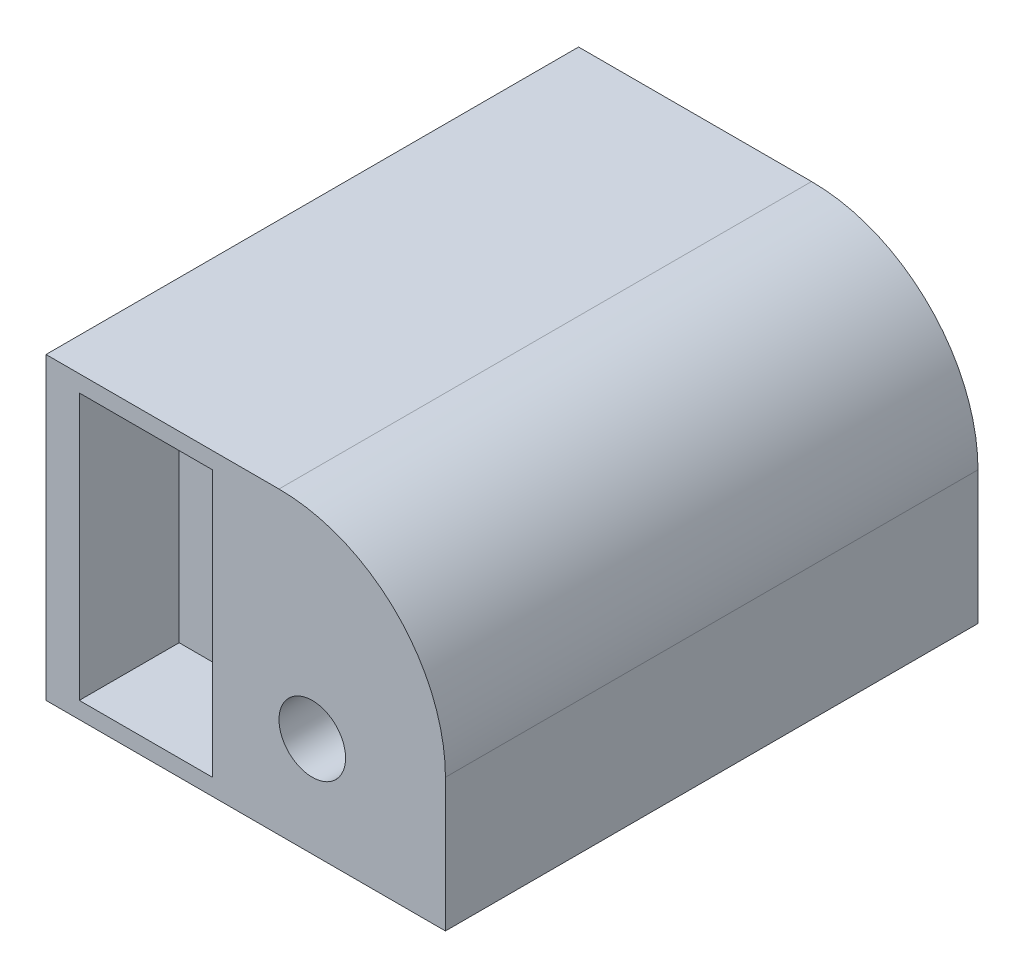
ISO-10303-21;
HEADER;
FILE_DESCRIPTION(('STEP AP214'),'2;1');
FILE_NAME('part.step','',(''),(''),'','','');
FILE_SCHEMA(('AUTOMOTIVE_DESIGN { 1 0 10303 214 1 1 1 1 }'));
ENDSEC;
DATA;
#1=APPLICATION_CONTEXT('core data for automotive mechanical design processes');
#2=APPLICATION_PROTOCOL_DEFINITION('international standard','automotive_design',2000,#1);
#3=PRODUCT_CONTEXT('',#1,'mechanical');
#4=PRODUCT('Part','Part','',(#3));
#5=PRODUCT_RELATED_PRODUCT_CATEGORY('part','',(#4));
#6=PRODUCT_DEFINITION_FORMATION('','',#4);
#7=PRODUCT_DEFINITION_CONTEXT('part definition',#1,'design');
#8=PRODUCT_DEFINITION('design','',#6,#7);
#9=PRODUCT_DEFINITION_SHAPE('','',#8);
#10=(LENGTH_UNIT() NAMED_UNIT(*) SI_UNIT(.MILLI.,.METRE.));
#11=(NAMED_UNIT(*) PLANE_ANGLE_UNIT() SI_UNIT($,.RADIAN.));
#12=(NAMED_UNIT(*) SI_UNIT($,.STERADIAN.) SOLID_ANGLE_UNIT());
#13=UNCERTAINTY_MEASURE_WITH_UNIT(LENGTH_MEASURE(1.E-05),#10,'distance_accuracy_value','');
#14=(GEOMETRIC_REPRESENTATION_CONTEXT(3) GLOBAL_UNCERTAINTY_ASSIGNED_CONTEXT((#13)) GLOBAL_UNIT_ASSIGNED_CONTEXT((#10,
#11,#12)) REPRESENTATION_CONTEXT('',''));
#15=CARTESIAN_POINT('',(0.,0.,0.));
#16=DIRECTION('',(0.,0.,1.));
#17=DIRECTION('',(1.,0.,0.));
#18=AXIS2_PLACEMENT_3D('',#15,#16,#17);
#19=CARTESIAN_POINT('',(1.41903870162297,6.69881398252185,101.6));
#20=DIRECTION('',(0.,0.,1.));
#21=DIRECTION('',(1.,0.,0.));
#22=AXIS2_PLACEMENT_3D('',#19,#20,#21);
#23=CYLINDRICAL_SURFACE('',#22,31.75);
#24=DIRECTION('',(0.,0.,1.));
#25=VECTOR('',#24,1.);
#26=CARTESIAN_POINT('',(33.169038701623,6.69881398252185,101.6));
#27=LINE('',#26,#25);
#28=CARTESIAN_POINT('',(33.169038701623,6.69881398252186,0.));
#29=VERTEX_POINT('',#28);
#30=CARTESIAN_POINT('',(33.169038701623,6.69881398252186,101.6));
#31=VERTEX_POINT('',#30);
#32=EDGE_CURVE('E282',#29,#31,#27,.T.);
#33=ORIENTED_EDGE('',*,*,#32,.F.);
#34=CARTESIAN_POINT('',(1.41903870162297,6.69881398252185,0.));
#35=DIRECTION('',(0.,0.,1.));
#36=DIRECTION('',(1.,0.,0.));
#37=AXIS2_PLACEMENT_3D('',#34,#35,#36);
#38=CIRCLE('',#37,31.75);
#39=CARTESIAN_POINT('',(1.41903870162297,38.4488139825219,0.));
#40=VERTEX_POINT('',#39);
#41=EDGE_CURVE('E49',#40,#29,#38,.F.);
#42=ORIENTED_EDGE('',*,*,#41,.F.);
#43=DIRECTION('',(0.,0.,1.));
#44=VECTOR('',#43,1.);
#45=CARTESIAN_POINT('',(1.41903870162297,38.4488139825219,101.6));
#46=LINE('',#45,#44);
#47=CARTESIAN_POINT('',(1.41903870162297,38.4488139825219,101.6));
#48=VERTEX_POINT('',#47);
#49=EDGE_CURVE('E286',#48,#40,#46,.F.);
#50=ORIENTED_EDGE('',*,*,#49,.F.);
#51=CARTESIAN_POINT('',(1.41903870162297,6.69881398252185,101.6));
#52=DIRECTION('',(0.,0.,1.));
#53=DIRECTION('',(1.,0.,0.));
#54=AXIS2_PLACEMENT_3D('',#51,#52,#53);
#55=CIRCLE('',#54,31.75);
#56=EDGE_CURVE('E11',#31,#48,#55,.T.);
#57=ORIENTED_EDGE('',*,*,#56,.F.);
#58=EDGE_LOOP('',(#33,#42,#50,#57));
#59=FACE_BOUND('',#58,.T.);
#60=ADVANCED_FACE('F41',(#59),#23,.T.);
#61=CARTESIAN_POINT('',(0.,0.,101.6));
#62=DIRECTION('',(0.,0.,1.));
#63=DIRECTION('',(1.,0.,0.));
#64=AXIS2_PLACEMENT_3D('',#61,#62,#63);
#65=PLANE('',#64);
#66=DIRECTION('',(0.,-1.,0.));
#67=VECTOR('',#66,1.);
#68=CARTESIAN_POINT('',(-36.680961298377,35.2738139825219,101.6));
#69=LINE('',#68,#67);
#70=CARTESIAN_POINT('',(-36.680961298377,35.2738139825219,101.6));
#71=VERTEX_POINT('',#70);
#72=CARTESIAN_POINT('',(-36.680961298377,-15.5261860174781,101.6));
#73=VERTEX_POINT('',#72);
#74=EDGE_CURVE('E140',#71,#73,#69,.T.);
#75=ORIENTED_EDGE('',*,*,#74,.F.);
#76=DIRECTION('',(-1.,0.,0.));
#77=VECTOR('',#76,1.);
#78=CARTESIAN_POINT('',(-36.680961298377,35.2738139825219,101.6));
#79=LINE('',#78,#77);
#80=CARTESIAN_POINT('',(-11.280961298377,35.2738139825219,101.6));
#81=VERTEX_POINT('',#80);
#82=EDGE_CURVE('E160',#81,#71,#79,.T.);
#83=ORIENTED_EDGE('',*,*,#82,.F.);
#84=DIRECTION('',(0.,1.,0.));
#85=VECTOR('',#84,1.);
#86=CARTESIAN_POINT('',(-11.280961298377,35.2738139825219,101.6));
#87=LINE('',#86,#85);
#88=CARTESIAN_POINT('',(-11.280961298377,-15.5261860174781,101.6));
#89=VERTEX_POINT('',#88);
#90=EDGE_CURVE('E164',#89,#81,#87,.T.);
#91=ORIENTED_EDGE('',*,*,#90,.F.);
#92=DIRECTION('',(1.,0.,0.));
#93=VECTOR('',#92,1.);
#94=CARTESIAN_POINT('',(-36.680961298377,-15.5261860174781,101.6));
#95=LINE('',#94,#93);
#96=EDGE_CURVE('E176',#73,#89,#95,.T.);
#97=ORIENTED_EDGE('',*,*,#96,.F.);
#98=EDGE_LOOP('',(#75,#83,#91,#97));
#99=FACE_BOUND('',#98,.T.);
#100=DIRECTION('',(0.,1.,0.));
#101=VECTOR('',#100,1.);
#102=CARTESIAN_POINT('',(33.169038701623,38.4488139825219,101.6));
#103=LINE('',#102,#101);
#104=CARTESIAN_POINT('',(33.169038701623,-18.7011860174781,101.6));
#105=VERTEX_POINT('',#104);
#106=EDGE_CURVE('E252',#105,#31,#103,.T.);
#107=ORIENTED_EDGE('',*,*,#106,.T.);
#108=ORIENTED_EDGE('',*,*,#56,.T.);
#109=DIRECTION('',(-1.,0.,0.));
#110=VECTOR('',#109,1.);
#111=CARTESIAN_POINT('',(-43.030961298377,38.4488139825219,101.6));
#112=LINE('',#111,#110);
#113=CARTESIAN_POINT('',(-43.030961298377,38.4488139825219,101.6));
#114=VERTEX_POINT('',#113);
#115=EDGE_CURVE('E255',#48,#114,#112,.T.);
#116=ORIENTED_EDGE('',*,*,#115,.T.);
#117=DIRECTION('',(0.,-1.,0.));
#118=VECTOR('',#117,1.);
#119=CARTESIAN_POINT('',(-43.030961298377,38.4488139825219,101.6));
#120=LINE('',#119,#118);
#121=CARTESIAN_POINT('',(-43.030961298377,-18.7011860174781,101.6));
#122=VERTEX_POINT('',#121);
#123=EDGE_CURVE('E244',#114,#122,#120,.T.);
#124=ORIENTED_EDGE('',*,*,#123,.T.);
#125=DIRECTION('',(1.,0.,0.));
#126=VECTOR('',#125,1.);
#127=CARTESIAN_POINT('',(-43.030961298377,-18.7011860174781,101.6));
#128=LINE('',#127,#126);
#129=EDGE_CURVE('E248',#122,#105,#128,.T.);
#130=ORIENTED_EDGE('',*,*,#129,.T.);
#131=EDGE_LOOP('',(#107,#108,#116,#124,#130));
#132=FACE_BOUND('',#131,.T.);
#133=CARTESIAN_POINT('',(7.76903870162297,0.348813982521855,101.6));
#134=DIRECTION('',(0.,0.,1.));
#135=DIRECTION('',(1.,0.,0.));
#136=AXIS2_PLACEMENT_3D('',#133,#134,#135);
#137=CIRCLE('',#136,6.35);
#138=CARTESIAN_POINT('',(14.119038701623,0.348813982521855,101.6));
#139=VERTEX_POINT('',#138);
#140=EDGE_CURVE('E236',#139,#139,#137,.T.);
#141=ORIENTED_EDGE('',*,*,#140,.F.);
#142=EDGE_LOOP('',(#141));
#143=FACE_BOUND('',#142,.T.);
#144=ADVANCED_FACE('F309',(#99,#132,#143),#65,.T.);
#145=CARTESIAN_POINT('',(0.,0.,0.));
#146=DIRECTION('',(0.,0.,1.));
#147=DIRECTION('',(1.,0.,0.));
#148=AXIS2_PLACEMENT_3D('',#145,#146,#147);
#149=PLANE('',#148);
#150=DIRECTION('',(-1.,0.,0.));
#151=VECTOR('',#150,1.);
#152=CARTESIAN_POINT('',(-43.030961298377,38.4488139825219,0.));
#153=LINE('',#152,#151);
#154=CARTESIAN_POINT('',(-43.030961298377,38.4488139825219,0.));
#155=VERTEX_POINT('',#154);
#156=EDGE_CURVE('E249',#40,#155,#153,.T.);
#157=ORIENTED_EDGE('',*,*,#156,.F.);
#158=ORIENTED_EDGE('',*,*,#41,.T.);
#159=DIRECTION('',(0.,1.,0.));
#160=VECTOR('',#159,1.);
#161=CARTESIAN_POINT('',(33.169038701623,38.4488139825219,0.));
#162=LINE('',#161,#160);
#163=CARTESIAN_POINT('',(33.169038701623,-18.7011860174781,0.));
#164=VERTEX_POINT('',#163);
#165=EDGE_CURVE('E265',#164,#29,#162,.T.);
#166=ORIENTED_EDGE('',*,*,#165,.F.);
#167=DIRECTION('',(1.,0.,0.));
#168=VECTOR('',#167,1.);
#169=CARTESIAN_POINT('',(-43.030961298377,-18.7011860174781,0.));
#170=LINE('',#169,#168);
#171=CARTESIAN_POINT('',(-43.030961298377,-18.7011860174781,0.));
#172=VERTEX_POINT('',#171);
#173=EDGE_CURVE('E262',#172,#164,#170,.T.);
#174=ORIENTED_EDGE('',*,*,#173,.F.);
#175=DIRECTION('',(0.,-1.,0.));
#176=VECTOR('',#175,1.);
#177=CARTESIAN_POINT('',(-43.030961298377,38.4488139825219,0.));
#178=LINE('',#177,#176);
#179=EDGE_CURVE('E240',#155,#172,#178,.T.);
#180=ORIENTED_EDGE('',*,*,#179,.F.);
#181=EDGE_LOOP('',(#157,#158,#166,#174,#180));
#182=FACE_BOUND('',#181,.T.);
#183=CARTESIAN_POINT('',(7.76903870162297,0.348813982521855,0.));
#184=DIRECTION('',(0.,0.,1.));
#185=DIRECTION('',(1.,0.,0.));
#186=AXIS2_PLACEMENT_3D('',#183,#184,#185);
#187=CIRCLE('',#186,6.35);
#188=CARTESIAN_POINT('',(14.119038701623,0.348813982521855,0.));
#189=VERTEX_POINT('',#188);
#190=EDGE_CURVE('E226',#189,#189,#187,.T.);
#191=ORIENTED_EDGE('',*,*,#190,.T.);
#192=EDGE_LOOP('',(#191));
#193=FACE_BOUND('',#192,.T.);
#194=ADVANCED_FACE('F292',(#182,#193),#149,.F.);
#195=CARTESIAN_POINT('',(-43.030961298377,38.4488139825219,101.6));
#196=DIRECTION('',(1.,0.,0.));
#197=DIRECTION('',(0.,0.,-1.));
#198=AXIS2_PLACEMENT_3D('',#195,#196,#197);
#199=PLANE('',#198);
#200=DIRECTION('',(0.,0.,1.));
#201=VECTOR('',#200,1.);
#202=CARTESIAN_POINT('',(-43.030961298377,-2.82618601747813,6.35));
#203=LINE('',#202,#201);
#204=CARTESIAN_POINT('',(-43.030961298377,-2.82618601747813,6.35000000000001));
#205=VERTEX_POINT('',#204);
#206=CARTESIAN_POINT('',(-43.030961298377,-2.82618601747813,57.15));
#207=VERTEX_POINT('',#206);
#208=EDGE_CURVE('E212',#205,#207,#203,.T.);
#209=ORIENTED_EDGE('',*,*,#208,.F.);
#210=DIRECTION('',(0.,-1.,0.));
#211=VECTOR('',#210,1.);
#212=CARTESIAN_POINT('',(-43.030961298377,22.5738139825219,6.35));
#213=LINE('',#212,#211);
#214=CARTESIAN_POINT('',(-43.030961298377,22.5738139825219,6.35));
#215=VERTEX_POINT('',#214);
#216=EDGE_CURVE('E186',#215,#205,#213,.T.);
#217=ORIENTED_EDGE('',*,*,#216,.F.);
#218=DIRECTION('',(0.,0.,-1.));
#219=VECTOR('',#218,1.);
#220=CARTESIAN_POINT('',(-43.030961298377,22.5738139825219,6.35));
#221=LINE('',#220,#219);
#222=CARTESIAN_POINT('',(-43.030961298377,22.5738139825219,57.15));
#223=VERTEX_POINT('',#222);
#224=EDGE_CURVE('E197',#223,#215,#221,.T.);
#225=ORIENTED_EDGE('',*,*,#224,.F.);
#226=DIRECTION('',(0.,1.,0.));
#227=VECTOR('',#226,1.);
#228=CARTESIAN_POINT('',(-43.030961298377,22.5738139825219,57.15));
#229=LINE('',#228,#227);
#230=EDGE_CURVE('E216',#207,#223,#229,.T.);
#231=ORIENTED_EDGE('',*,*,#230,.F.);
#232=EDGE_LOOP('',(#209,#217,#225,#231));
#233=FACE_BOUND('',#232,.T.);
#234=ORIENTED_EDGE('',*,*,#179,.T.);
#235=DIRECTION('',(0.,0.,-1.));
#236=VECTOR('',#235,1.);
#237=CARTESIAN_POINT('',(-43.030961298377,-18.7011860174781,101.6));
#238=LINE('',#237,#236);
#239=EDGE_CURVE('E278',#122,#172,#238,.T.);
#240=ORIENTED_EDGE('',*,*,#239,.F.);
#241=ORIENTED_EDGE('',*,*,#123,.F.);
#242=DIRECTION('',(0.,0.,-1.));
#243=VECTOR('',#242,1.);
#244=CARTESIAN_POINT('',(-43.030961298377,38.4488139825219,101.6));
#245=LINE('',#244,#243);
#246=EDGE_CURVE('E258',#114,#155,#245,.T.);
#247=ORIENTED_EDGE('',*,*,#246,.T.);
#248=EDGE_LOOP('',(#234,#240,#241,#247));
#249=FACE_BOUND('',#248,.T.);
#250=ADVANCED_FACE('F303',(#233,#249),#199,.F.);
#251=CARTESIAN_POINT('',(-43.030961298377,-18.7011860174781,101.6));
#252=DIRECTION('',(0.,1.,0.));
#253=DIRECTION('',(0.,0.,1.));
#254=AXIS2_PLACEMENT_3D('',#251,#252,#253);
#255=PLANE('',#254);
#256=ORIENTED_EDGE('',*,*,#173,.T.);
#257=DIRECTION('',(0.,0.,-1.));
#258=VECTOR('',#257,1.);
#259=CARTESIAN_POINT('',(33.169038701623,-18.7011860174781,101.6));
#260=LINE('',#259,#258);
#261=EDGE_CURVE('E274',#105,#164,#260,.T.);
#262=ORIENTED_EDGE('',*,*,#261,.F.);
#263=ORIENTED_EDGE('',*,*,#129,.F.);
#264=ORIENTED_EDGE('',*,*,#239,.T.);
#265=EDGE_LOOP('',(#256,#262,#263,#264));
#266=FACE_BOUND('',#265,.T.);
#267=ADVANCED_FACE('F300',(#266),#255,.F.);
#268=CARTESIAN_POINT('',(33.169038701623,38.4488139825219,101.6));
#269=DIRECTION('',(-1.,0.,0.));
#270=DIRECTION('',(0.,-1.,0.));
#271=AXIS2_PLACEMENT_3D('',#268,#269,#270);
#272=PLANE('',#271);
#273=ORIENTED_EDGE('',*,*,#165,.T.);
#274=ORIENTED_EDGE('',*,*,#32,.T.);
#275=ORIENTED_EDGE('',*,*,#106,.F.);
#276=ORIENTED_EDGE('',*,*,#261,.T.);
#277=EDGE_LOOP('',(#273,#274,#275,#276));
#278=FACE_BOUND('',#277,.T.);
#279=ADVANCED_FACE('F297',(#278),#272,.F.);
#280=CARTESIAN_POINT('',(-43.030961298377,38.4488139825219,101.6));
#281=DIRECTION('',(0.,-1.,0.));
#282=DIRECTION('',(0.,0.,-1.));
#283=AXIS2_PLACEMENT_3D('',#280,#281,#282);
#284=PLANE('',#283);
#285=ORIENTED_EDGE('',*,*,#115,.F.);
#286=ORIENTED_EDGE('',*,*,#49,.T.);
#287=ORIENTED_EDGE('',*,*,#156,.T.);
#288=ORIENTED_EDGE('',*,*,#246,.F.);
#289=EDGE_LOOP('',(#285,#286,#287,#288));
#290=FACE_BOUND('',#289,.T.);
#291=ADVANCED_FACE('F308',(#290),#284,.F.);
#292=CARTESIAN_POINT('',(7.76903870162297,0.348813982521855,101.6));
#293=DIRECTION('',(0.,0.,-1.));
#294=DIRECTION('',(-1.,0.,0.));
#295=AXIS2_PLACEMENT_3D('',#292,#293,#294);
#296=CYLINDRICAL_SURFACE('',#295,6.35);
#297=ORIENTED_EDGE('',*,*,#140,.T.);
#298=EDGE_LOOP('',(#297));
#299=FACE_BOUND('',#298,.T.);
#300=ORIENTED_EDGE('',*,*,#190,.F.);
#301=EDGE_LOOP('',(#300));
#302=FACE_BOUND('',#301,.T.);
#303=ADVANCED_FACE('F316',(#299,#302),#296,.F.);
#304=CARTESIAN_POINT('',(-23.980961298377,22.5738139825219,6.35));
#305=DIRECTION('',(0.,0.,-1.));
#306=DIRECTION('',(0.,1.,0.));
#307=AXIS2_PLACEMENT_3D('',#304,#305,#306);
#308=PLANE('',#307);
#309=ORIENTED_EDGE('',*,*,#216,.T.);
#310=DIRECTION('',(-1.,0.,0.));
#311=VECTOR('',#310,1.);
#312=CARTESIAN_POINT('',(-23.980961298377,-2.82618601747812,6.35));
#313=LINE('',#312,#311);
#314=CARTESIAN_POINT('',(-23.980961298377,-2.82618601747812,6.35));
#315=VERTEX_POINT('',#314);
#316=EDGE_CURVE('E209',#315,#205,#313,.T.);
#317=ORIENTED_EDGE('',*,*,#316,.F.);
#318=DIRECTION('',(0.,-1.,0.));
#319=VECTOR('',#318,1.);
#320=CARTESIAN_POINT('',(-23.980961298377,22.5738139825219,6.35));
#321=LINE('',#320,#319);
#322=CARTESIAN_POINT('',(-23.980961298377,22.5738139825219,6.35));
#323=VERTEX_POINT('',#322);
#324=EDGE_CURVE('E192',#323,#315,#321,.T.);
#325=ORIENTED_EDGE('',*,*,#324,.F.);
#326=DIRECTION('',(-1.,0.,0.));
#327=VECTOR('',#326,1.);
#328=CARTESIAN_POINT('',(-23.980961298377,22.5738139825219,6.35));
#329=LINE('',#328,#327);
#330=EDGE_CURVE('E223',#323,#215,#329,.T.);
#331=ORIENTED_EDGE('',*,*,#330,.T.);
#332=EDGE_LOOP('',(#309,#317,#325,#331));
#333=FACE_BOUND('',#332,.T.);
#334=ADVANCED_FACE('F319',(#333),#308,.F.);
#335=CARTESIAN_POINT('',(-23.980961298377,22.5738139825219,6.35));
#336=DIRECTION('',(0.,1.,0.));
#337=DIRECTION('',(-1.,0.,0.));
#338=AXIS2_PLACEMENT_3D('',#335,#336,#337);
#339=PLANE('',#338);
#340=ORIENTED_EDGE('',*,*,#224,.T.);
#341=ORIENTED_EDGE('',*,*,#330,.F.);
#342=DIRECTION('',(0.,0.,-1.));
#343=VECTOR('',#342,1.);
#344=CARTESIAN_POINT('',(-23.980961298377,22.5738139825219,6.35));
#345=LINE('',#344,#343);
#346=CARTESIAN_POINT('',(-23.980961298377,22.5738139825219,57.15));
#347=VERTEX_POINT('',#346);
#348=EDGE_CURVE('E205',#347,#323,#345,.T.);
#349=ORIENTED_EDGE('',*,*,#348,.F.);
#350=DIRECTION('',(-1.,0.,0.));
#351=VECTOR('',#350,1.);
#352=CARTESIAN_POINT('',(-23.980961298377,22.5738139825219,57.15));
#353=LINE('',#352,#351);
#354=EDGE_CURVE('E227',#347,#223,#353,.T.);
#355=ORIENTED_EDGE('',*,*,#354,.T.);
#356=EDGE_LOOP('',(#340,#341,#349,#355));
#357=FACE_BOUND('',#356,.T.);
#358=ADVANCED_FACE('F408',(#357),#339,.F.);
#359=CARTESIAN_POINT('',(-23.980961298377,22.5738139825219,57.15));
#360=DIRECTION('',(0.,0.,1.));
#361=DIRECTION('',(0.,-1.,0.));
#362=AXIS2_PLACEMENT_3D('',#359,#360,#361);
#363=PLANE('',#362);
#364=ORIENTED_EDGE('',*,*,#230,.T.);
#365=ORIENTED_EDGE('',*,*,#354,.F.);
#366=DIRECTION('',(0.,1.,0.));
#367=VECTOR('',#366,1.);
#368=CARTESIAN_POINT('',(-23.980961298377,22.5738139825219,57.15));
#369=LINE('',#368,#367);
#370=CARTESIAN_POINT('',(-23.980961298377,-2.82618601747812,57.15));
#371=VERTEX_POINT('',#370);
#372=EDGE_CURVE('E201',#371,#347,#369,.T.);
#373=ORIENTED_EDGE('',*,*,#372,.F.);
#374=DIRECTION('',(-1.,0.,0.));
#375=VECTOR('',#374,1.);
#376=CARTESIAN_POINT('',(-23.980961298377,-2.82618601747812,57.15));
#377=LINE('',#376,#375);
#378=EDGE_CURVE('E230',#371,#207,#377,.T.);
#379=ORIENTED_EDGE('',*,*,#378,.T.);
#380=EDGE_LOOP('',(#364,#365,#373,#379));
#381=FACE_BOUND('',#380,.T.);
#382=ADVANCED_FACE('F401',(#381),#363,.F.);
#383=CARTESIAN_POINT('',(-23.980961298377,-2.82618601747812,6.35));
#384=DIRECTION('',(0.,-1.,0.));
#385=DIRECTION('',(1.,0.,0.));
#386=AXIS2_PLACEMENT_3D('',#383,#384,#385);
#387=PLANE('',#386);
#388=ORIENTED_EDGE('',*,*,#208,.T.);
#389=ORIENTED_EDGE('',*,*,#378,.F.);
#390=DIRECTION('',(0.,0.,1.));
#391=VECTOR('',#390,1.);
#392=CARTESIAN_POINT('',(-23.980961298377,-2.82618601747812,6.35));
#393=LINE('',#392,#391);
#394=EDGE_CURVE('E196',#315,#371,#393,.T.);
#395=ORIENTED_EDGE('',*,*,#394,.F.);
#396=ORIENTED_EDGE('',*,*,#316,.T.);
#397=EDGE_LOOP('',(#388,#389,#395,#396));
#398=FACE_BOUND('',#397,.T.);
#399=ADVANCED_FACE('F392',(#398),#387,.F.);
#400=CARTESIAN_POINT('',(-23.980961298377,0.,0.));
#401=DIRECTION('',(-1.,0.,0.));
#402=DIRECTION('',(0.,-1.,0.));
#403=AXIS2_PLACEMENT_3D('',#400,#401,#402);
#404=PLANE('',#403);
#405=CARTESIAN_POINT('',(-23.980961298377,9.87381398252188,44.45));
#406=DIRECTION('',(-1.,0.,0.));
#407=DIRECTION('',(0.,-1.,0.));
#408=AXIS2_PLACEMENT_3D('',#405,#406,#407);
#409=CIRCLE('',#408,6.35);
#410=CARTESIAN_POINT('',(-23.980961298377,3.52381398252187,44.45));
#411=VERTEX_POINT('',#410);
#412=EDGE_CURVE('E167',#411,#411,#409,.T.);
#413=ORIENTED_EDGE('',*,*,#412,.F.);
#414=EDGE_LOOP('',(#413));
#415=FACE_BOUND('',#414,.T.);
#416=ORIENTED_EDGE('',*,*,#324,.T.);
#417=ORIENTED_EDGE('',*,*,#394,.T.);
#418=ORIENTED_EDGE('',*,*,#372,.T.);
#419=ORIENTED_EDGE('',*,*,#348,.T.);
#420=EDGE_LOOP('',(#416,#417,#418,#419));
#421=FACE_BOUND('',#420,.T.);
#422=ADVANCED_FACE('F384',(#415,#421),#404,.T.);
#423=CARTESIAN_POINT('',(-36.680961298377,35.2738139825219,82.55));
#424=DIRECTION('',(-1.,0.,0.));
#425=DIRECTION('',(0.,0.,1.));
#426=AXIS2_PLACEMENT_3D('',#423,#424,#425);
#427=PLANE('',#426);
#428=ORIENTED_EDGE('',*,*,#74,.T.);
#429=DIRECTION('',(0.,0.,1.));
#430=VECTOR('',#429,1.);
#431=CARTESIAN_POINT('',(-36.680961298377,-15.5261860174781,82.55));
#432=LINE('',#431,#430);
#433=CARTESIAN_POINT('',(-36.680961298377,-15.5261860174781,82.55));
#434=VERTEX_POINT('',#433);
#435=EDGE_CURVE('E133',#434,#73,#432,.T.);
#436=ORIENTED_EDGE('',*,*,#435,.F.);
#437=DIRECTION('',(0.,-1.,0.));
#438=VECTOR('',#437,1.);
#439=CARTESIAN_POINT('',(-36.680961298377,35.2738139825219,82.55));
#440=LINE('',#439,#438);
#441=CARTESIAN_POINT('',(-36.680961298377,35.2738139825219,82.55));
#442=VERTEX_POINT('',#441);
#443=EDGE_CURVE('E137',#442,#434,#440,.T.);
#444=ORIENTED_EDGE('',*,*,#443,.F.);
#445=DIRECTION('',(0.,0.,1.));
#446=VECTOR('',#445,1.);
#447=CARTESIAN_POINT('',(-36.680961298377,35.2738139825219,82.55));
#448=LINE('',#447,#446);
#449=EDGE_CURVE('E183',#442,#71,#448,.T.);
#450=ORIENTED_EDGE('',*,*,#449,.T.);
#451=EDGE_LOOP('',(#428,#436,#444,#450));
#452=FACE_BOUND('',#451,.T.);
#453=ADVANCED_FACE('F135',(#452),#427,.F.);
#454=CARTESIAN_POINT('',(-36.680961298377,35.2738139825219,82.55));
#455=DIRECTION('',(0.,1.,0.));
#456=DIRECTION('',(0.,0.,1.));
#457=AXIS2_PLACEMENT_3D('',#454,#455,#456);
#458=PLANE('',#457);
#459=ORIENTED_EDGE('',*,*,#82,.T.);
#460=ORIENTED_EDGE('',*,*,#449,.F.);
#461=DIRECTION('',(-1.,0.,0.));
#462=VECTOR('',#461,1.);
#463=CARTESIAN_POINT('',(-36.680961298377,35.2738139825219,82.55));
#464=LINE('',#463,#462);
#465=CARTESIAN_POINT('',(-11.280961298377,35.2738139825219,82.55));
#466=VERTEX_POINT('',#465);
#467=EDGE_CURVE('E146',#466,#442,#464,.T.);
#468=ORIENTED_EDGE('',*,*,#467,.F.);
#469=DIRECTION('',(0.,0.,1.));
#470=VECTOR('',#469,1.);
#471=CARTESIAN_POINT('',(-11.280961298377,35.2738139825219,82.55));
#472=LINE('',#471,#470);
#473=EDGE_CURVE('E187',#466,#81,#472,.T.);
#474=ORIENTED_EDGE('',*,*,#473,.T.);
#475=EDGE_LOOP('',(#459,#460,#468,#474));
#476=FACE_BOUND('',#475,.T.);
#477=ADVANCED_FACE('F369',(#476),#458,.F.);
#478=CARTESIAN_POINT('',(-11.280961298377,35.2738139825219,82.55));
#479=DIRECTION('',(1.,0.,0.));
#480=DIRECTION('',(0.,1.,0.));
#481=AXIS2_PLACEMENT_3D('',#478,#479,#480);
#482=PLANE('',#481);
#483=ORIENTED_EDGE('',*,*,#90,.T.);
#484=ORIENTED_EDGE('',*,*,#473,.F.);
#485=DIRECTION('',(0.,1.,0.));
#486=VECTOR('',#485,1.);
#487=CARTESIAN_POINT('',(-11.280961298377,35.2738139825219,82.55));
#488=LINE('',#487,#486);
#489=CARTESIAN_POINT('',(-11.280961298377,-15.5261860174781,82.55));
#490=VERTEX_POINT('',#489);
#491=EDGE_CURVE('E155',#490,#466,#488,.T.);
#492=ORIENTED_EDGE('',*,*,#491,.F.);
#493=DIRECTION('',(0.,0.,1.));
#494=VECTOR('',#493,1.);
#495=CARTESIAN_POINT('',(-11.280961298377,-15.5261860174781,82.55));
#496=LINE('',#495,#494);
#497=EDGE_CURVE('E145',#490,#89,#496,.T.);
#498=ORIENTED_EDGE('',*,*,#497,.T.);
#499=EDGE_LOOP('',(#483,#484,#492,#498));
#500=FACE_BOUND('',#499,.T.);
#501=ADVANCED_FACE('F362',(#500),#482,.F.);
#502=CARTESIAN_POINT('',(-36.680961298377,-15.5261860174781,82.55));
#503=DIRECTION('',(0.,-1.,0.));
#504=DIRECTION('',(0.,0.,-1.));
#505=AXIS2_PLACEMENT_3D('',#502,#503,#504);
#506=PLANE('',#505);
#507=ORIENTED_EDGE('',*,*,#96,.T.);
#508=ORIENTED_EDGE('',*,*,#497,.F.);
#509=DIRECTION('',(1.,0.,0.));
#510=VECTOR('',#509,1.);
#511=CARTESIAN_POINT('',(-36.680961298377,-15.5261860174781,82.55));
#512=LINE('',#511,#510);
#513=EDGE_CURVE('E149',#434,#490,#512,.T.);
#514=ORIENTED_EDGE('',*,*,#513,.F.);
#515=ORIENTED_EDGE('',*,*,#435,.T.);
#516=EDGE_LOOP('',(#507,#508,#514,#515));
#517=FACE_BOUND('',#516,.T.);
#518=ADVANCED_FACE('F150',(#517),#506,.F.);
#519=CARTESIAN_POINT('',(0.,0.,82.55));
#520=DIRECTION('',(0.,0.,1.));
#521=DIRECTION('',(1.,0.,0.));
#522=AXIS2_PLACEMENT_3D('',#519,#520,#521);
#523=PLANE('',#522);
#524=ORIENTED_EDGE('',*,*,#443,.T.);
#525=ORIENTED_EDGE('',*,*,#513,.T.);
#526=ORIENTED_EDGE('',*,*,#491,.T.);
#527=ORIENTED_EDGE('',*,*,#467,.T.);
#528=EDGE_LOOP('',(#524,#525,#526,#527));
#529=FACE_BOUND('',#528,.T.);
#530=ADVANCED_FACE('F157',(#529),#523,.T.);
#531=CARTESIAN_POINT('',(-26.520961298377,9.87381398252188,44.45));
#532=DIRECTION('',(1.,0.,0.));
#533=DIRECTION('',(0.,1.,0.));
#534=AXIS2_PLACEMENT_3D('',#531,#532,#533);
#535=CYLINDRICAL_SURFACE('',#534,6.35);
#536=CARTESIAN_POINT('',(-26.520961298377,9.87381398252188,44.45));
#537=DIRECTION('',(-1.,0.,0.));
#538=DIRECTION('',(0.,-1.,0.));
#539=AXIS2_PLACEMENT_3D('',#536,#537,#538);
#540=CIRCLE('',#539,6.35);
#541=CARTESIAN_POINT('',(-26.520961298377,3.52381398252187,44.45));
#542=VERTEX_POINT('',#541);
#543=EDGE_CURVE('E177',#542,#542,#540,.T.);
#544=ORIENTED_EDGE('',*,*,#543,.F.);
#545=EDGE_LOOP('',(#544));
#546=FACE_BOUND('',#545,.T.);
#547=ORIENTED_EDGE('',*,*,#412,.T.);
#548=EDGE_LOOP('',(#547));
#549=FACE_BOUND('',#548,.T.);
#550=ADVANCED_FACE('F340',(#546,#549),#535,.T.);
#551=CARTESIAN_POINT('',(-26.520961298377,9.87381398252188,44.45));
#552=DIRECTION('',(-1.,0.,0.));
#553=DIRECTION('',(0.,-1.,0.));
#554=AXIS2_PLACEMENT_3D('',#551,#552,#553);
#555=PLANE('',#554);
#556=ORIENTED_EDGE('',*,*,#543,.T.);
#557=EDGE_LOOP('',(#556));
#558=FACE_BOUND('',#557,.T.);
#559=ADVANCED_FACE('F337',(#558),#555,.T.);
#560=CLOSED_SHELL('',(#60,#144,#194,#250,#267,#279,#291,#303,#334,#358,#382,#399,#422,#453,#477,
#501,#518,#530,#550,#559));
#561=MANIFOLD_SOLID_BREP('B2',#560);
#562=ADVANCED_BREP_SHAPE_REPRESENTATION('',(#18,#561),#14);
#563=SHAPE_DEFINITION_REPRESENTATION(#9,#562);
ENDSEC;
END-ISO-10303-21;
